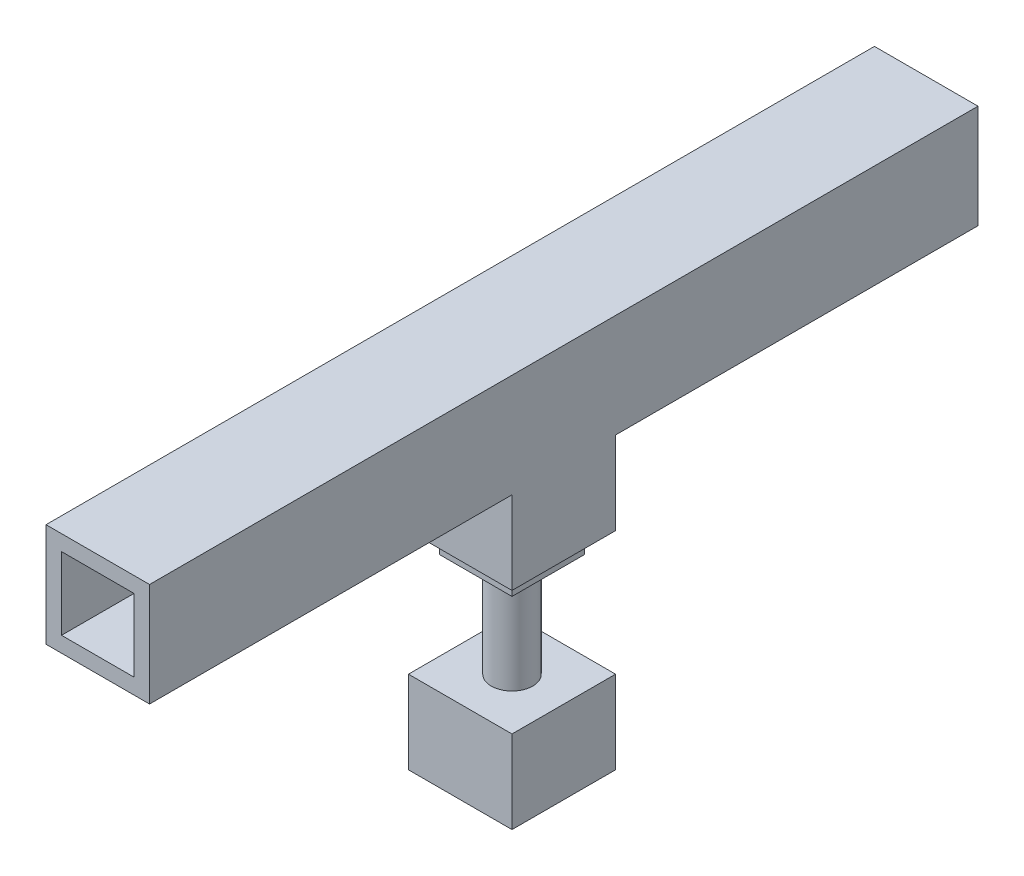
ISO-10303-21;
HEADER;
FILE_DESCRIPTION(('STEP AP214'),'2;1');
FILE_NAME('part.step','',(''),(''),'','','');
FILE_SCHEMA(('AUTOMOTIVE_DESIGN { 1 0 10303 214 1 1 1 1 }'));
ENDSEC;
DATA;
#1=APPLICATION_CONTEXT('core data for automotive mechanical design processes');
#2=APPLICATION_PROTOCOL_DEFINITION('international standard','automotive_design',2000,#1);
#3=PRODUCT_CONTEXT('',#1,'mechanical');
#4=PRODUCT('Part','Part','',(#3));
#5=PRODUCT_RELATED_PRODUCT_CATEGORY('part','',(#4));
#6=PRODUCT_DEFINITION_FORMATION('','',#4);
#7=PRODUCT_DEFINITION_CONTEXT('part definition',#1,'design');
#8=PRODUCT_DEFINITION('design','',#6,#7);
#9=PRODUCT_DEFINITION_SHAPE('','',#8);
#10=(LENGTH_UNIT() NAMED_UNIT(*) SI_UNIT(.MILLI.,.METRE.));
#11=(NAMED_UNIT(*) PLANE_ANGLE_UNIT() SI_UNIT($,.RADIAN.));
#12=(NAMED_UNIT(*) SI_UNIT($,.STERADIAN.) SOLID_ANGLE_UNIT());
#13=UNCERTAINTY_MEASURE_WITH_UNIT(LENGTH_MEASURE(1.E-05),#10,'distance_accuracy_value','');
#14=(GEOMETRIC_REPRESENTATION_CONTEXT(3) GLOBAL_UNCERTAINTY_ASSIGNED_CONTEXT((#13)) GLOBAL_UNIT_ASSIGNED_CONTEXT((#10,
#11,#12)) REPRESENTATION_CONTEXT('',''));
#15=CARTESIAN_POINT('',(0.,0.,0.));
#16=DIRECTION('',(0.,0.,1.));
#17=DIRECTION('',(1.,0.,0.));
#18=AXIS2_PLACEMENT_3D('',#15,#16,#17);
#19=CARTESIAN_POINT('',(0.,-75.,0.));
#20=DIRECTION('',(0.,-1.,0.));
#21=DIRECTION('',(0.,0.,-1.));
#22=AXIS2_PLACEMENT_3D('',#19,#20,#21);
#23=PLANE('',#22);
#24=CARTESIAN_POINT('',(0.,-75.,0.));
#25=DIRECTION('',(0.,-1.,0.));
#26=DIRECTION('',(0.,0.,-1.));
#27=AXIS2_PLACEMENT_3D('',#24,#25,#26);
#28=CIRCLE('',#27,10.);
#29=CARTESIAN_POINT('',(0.,-75.,-10.));
#30=VERTEX_POINT('',#29);
#31=EDGE_CURVE('E54',#30,#30,#28,.T.);
#32=ORIENTED_EDGE('',*,*,#31,.F.);
#33=EDGE_LOOP('',(#32));
#34=FACE_BOUND('',#33,.T.);
#35=CARTESIAN_POINT('',(0.,-75.,0.));
#36=DIRECTION('',(0.,-1.,0.));
#37=DIRECTION('',(0.,0.,-1.));
#38=AXIS2_PLACEMENT_3D('',#35,#36,#37);
#39=CIRCLE('',#38,5.);
#40=CARTESIAN_POINT('',(0.,-75.,-5.));
#41=VERTEX_POINT('',#40);
#42=EDGE_CURVE('E129',#41,#41,#39,.T.);
#43=ORIENTED_EDGE('',*,*,#42,.T.);
#44=EDGE_LOOP('',(#43));
#45=FACE_BOUND('',#44,.T.);
#46=ADVANCED_FACE('F50',(#34,#45),#23,.F.);
#47=CARTESIAN_POINT('',(0.,-125.,0.));
#48=DIRECTION('',(0.,1.,0.));
#49=DIRECTION('',(0.,0.,1.));
#50=AXIS2_PLACEMENT_3D('',#47,#48,#49);
#51=CYLINDRICAL_SURFACE('',#50,10.);
#52=CARTESIAN_POINT('',(0.,-125.,0.));
#53=DIRECTION('',(0.,-1.,0.));
#54=DIRECTION('',(0.,0.,-1.));
#55=AXIS2_PLACEMENT_3D('',#52,#53,#54);
#56=CIRCLE('',#55,10.);
#57=CARTESIAN_POINT('',(0.,-125.,-10.));
#58=VERTEX_POINT('',#57);
#59=EDGE_CURVE('E12',#58,#58,#56,.T.);
#60=ORIENTED_EDGE('',*,*,#59,.F.);
#61=EDGE_LOOP('',(#60));
#62=FACE_BOUND('',#61,.T.);
#63=ORIENTED_EDGE('',*,*,#31,.T.);
#64=EDGE_LOOP('',(#63));
#65=FACE_BOUND('',#64,.T.);
#66=ADVANCED_FACE('F52',(#62,#65),#51,.T.);
#67=CARTESIAN_POINT('',(0.,-125.,0.));
#68=DIRECTION('',(0.,1.,0.));
#69=DIRECTION('',(0.,0.,1.));
#70=AXIS2_PLACEMENT_3D('',#67,#68,#69);
#71=CYLINDRICAL_SURFACE('',#70,5.);
#72=ORIENTED_EDGE('',*,*,#42,.F.);
#73=EDGE_LOOP('',(#72));
#74=FACE_BOUND('',#73,.T.);
#75=CARTESIAN_POINT('',(0.,-165.,0.));
#76=DIRECTION('',(0.,-1.,0.));
#77=DIRECTION('',(0.,0.,-1.));
#78=AXIS2_PLACEMENT_3D('',#75,#76,#77);
#79=CIRCLE('',#78,5.);
#80=CARTESIAN_POINT('',(0.,-165.,-4.99999999999999));
#81=VERTEX_POINT('',#80);
#82=EDGE_CURVE('E122',#81,#81,#79,.T.);
#83=ORIENTED_EDGE('',*,*,#82,.T.);
#84=EDGE_LOOP('',(#83));
#85=FACE_BOUND('',#84,.T.);
#86=ADVANCED_FACE('F141',(#74,#85),#71,.F.);
#87=CARTESIAN_POINT('',(0.,-165.,0.));
#88=DIRECTION('',(0.,1.,0.));
#89=DIRECTION('',(0.,0.,1.));
#90=AXIS2_PLACEMENT_3D('',#87,#88,#89);
#91=PLANE('',#90);
#92=DIRECTION('',(0.,0.,1.));
#93=VECTOR('',#92,1.);
#94=CARTESIAN_POINT('',(25.,-165.,-25.));
#95=LINE('',#94,#93);
#96=CARTESIAN_POINT('',(25.,-165.,-25.));
#97=VERTEX_POINT('',#96);
#98=CARTESIAN_POINT('',(25.,-165.,25.));
#99=VERTEX_POINT('',#98);
#100=EDGE_CURVE('E104',#97,#99,#95,.T.);
#101=ORIENTED_EDGE('',*,*,#100,.T.);
#102=DIRECTION('',(-1.,0.,0.));
#103=VECTOR('',#102,1.);
#104=CARTESIAN_POINT('',(-25.,-165.,25.));
#105=LINE('',#104,#103);
#106=CARTESIAN_POINT('',(-25.,-165.,25.));
#107=VERTEX_POINT('',#106);
#108=EDGE_CURVE('E98',#99,#107,#105,.T.);
#109=ORIENTED_EDGE('',*,*,#108,.T.);
#110=DIRECTION('',(0.,0.,-1.));
#111=VECTOR('',#110,1.);
#112=CARTESIAN_POINT('',(-25.,-165.,-25.));
#113=LINE('',#112,#111);
#114=CARTESIAN_POINT('',(-25.,-165.,-25.));
#115=VERTEX_POINT('',#114);
#116=EDGE_CURVE('E102',#107,#115,#113,.T.);
#117=ORIENTED_EDGE('',*,*,#116,.T.);
#118=DIRECTION('',(1.,0.,0.));
#119=VECTOR('',#118,1.);
#120=CARTESIAN_POINT('',(-25.,-165.,-25.));
#121=LINE('',#120,#119);
#122=EDGE_CURVE('E67',#115,#97,#121,.T.);
#123=ORIENTED_EDGE('',*,*,#122,.T.);
#124=EDGE_LOOP('',(#101,#109,#117,#123));
#125=FACE_BOUND('',#124,.T.);
#126=ORIENTED_EDGE('',*,*,#82,.F.);
#127=EDGE_LOOP('',(#126));
#128=FACE_BOUND('',#127,.T.);
#129=ADVANCED_FACE('F99',(#125,#128),#91,.F.);
#130=CARTESIAN_POINT('',(0.,-125.,0.));
#131=DIRECTION('',(0.,1.,0.));
#132=DIRECTION('',(0.,0.,1.));
#133=AXIS2_PLACEMENT_3D('',#130,#131,#132);
#134=PLANE('',#133);
#135=ORIENTED_EDGE('',*,*,#59,.T.);
#136=EDGE_LOOP('',(#135));
#137=FACE_BOUND('',#136,.T.);
#138=DIRECTION('',(0.,0.,1.));
#139=VECTOR('',#138,1.);
#140=CARTESIAN_POINT('',(25.,-125.,-25.));
#141=LINE('',#140,#139);
#142=CARTESIAN_POINT('',(25.,-125.,-25.));
#143=VERTEX_POINT('',#142);
#144=CARTESIAN_POINT('',(25.,-125.,25.));
#145=VERTEX_POINT('',#144);
#146=EDGE_CURVE('E119',#143,#145,#141,.T.);
#147=ORIENTED_EDGE('',*,*,#146,.F.);
#148=DIRECTION('',(1.,0.,0.));
#149=VECTOR('',#148,1.);
#150=CARTESIAN_POINT('',(-25.,-125.,-25.));
#151=LINE('',#150,#149);
#152=CARTESIAN_POINT('',(-25.,-125.,-25.));
#153=VERTEX_POINT('',#152);
#154=EDGE_CURVE('E90',#153,#143,#151,.T.);
#155=ORIENTED_EDGE('',*,*,#154,.F.);
#156=DIRECTION('',(0.,0.,-1.));
#157=VECTOR('',#156,1.);
#158=CARTESIAN_POINT('',(-25.,-125.,-25.));
#159=LINE('',#158,#157);
#160=CARTESIAN_POINT('',(-25.,-125.,25.));
#161=VERTEX_POINT('',#160);
#162=EDGE_CURVE('E84',#161,#153,#159,.T.);
#163=ORIENTED_EDGE('',*,*,#162,.F.);
#164=DIRECTION('',(-1.,0.,0.));
#165=VECTOR('',#164,1.);
#166=CARTESIAN_POINT('',(-25.,-125.,25.));
#167=LINE('',#166,#165);
#168=EDGE_CURVE('E109',#145,#161,#167,.T.);
#169=ORIENTED_EDGE('',*,*,#168,.F.);
#170=EDGE_LOOP('',(#147,#155,#163,#169));
#171=FACE_BOUND('',#170,.T.);
#172=ADVANCED_FACE('F150',(#137,#171),#134,.T.);
#173=CARTESIAN_POINT('',(25.,-165.,-25.));
#174=DIRECTION('',(-1.,0.,0.));
#175=DIRECTION('',(0.,0.,1.));
#176=AXIS2_PLACEMENT_3D('',#173,#174,#175);
#177=PLANE('',#176);
#178=ORIENTED_EDGE('',*,*,#146,.T.);
#179=DIRECTION('',(0.,1.,0.));
#180=VECTOR('',#179,1.);
#181=CARTESIAN_POINT('',(25.,-165.,25.));
#182=LINE('',#181,#180);
#183=EDGE_CURVE('E110',#99,#145,#182,.T.);
#184=ORIENTED_EDGE('',*,*,#183,.F.);
#185=ORIENTED_EDGE('',*,*,#100,.F.);
#186=DIRECTION('',(0.,1.,0.));
#187=VECTOR('',#186,1.);
#188=CARTESIAN_POINT('',(25.,-165.,-25.));
#189=LINE('',#188,#187);
#190=EDGE_CURVE('E115',#97,#143,#189,.T.);
#191=ORIENTED_EDGE('',*,*,#190,.T.);
#192=EDGE_LOOP('',(#178,#184,#185,#191));
#193=FACE_BOUND('',#192,.T.);
#194=ADVANCED_FACE('F147',(#193),#177,.F.);
#195=CARTESIAN_POINT('',(-25.,-165.,25.));
#196=DIRECTION('',(0.,0.,-1.));
#197=DIRECTION('',(-1.,0.,0.));
#198=AXIS2_PLACEMENT_3D('',#195,#196,#197);
#199=PLANE('',#198);
#200=ORIENTED_EDGE('',*,*,#168,.T.);
#201=DIRECTION('',(0.,1.,0.));
#202=VECTOR('',#201,1.);
#203=CARTESIAN_POINT('',(-25.,-165.,25.));
#204=LINE('',#203,#202);
#205=EDGE_CURVE('E107',#107,#161,#204,.T.);
#206=ORIENTED_EDGE('',*,*,#205,.F.);
#207=ORIENTED_EDGE('',*,*,#108,.F.);
#208=ORIENTED_EDGE('',*,*,#183,.T.);
#209=EDGE_LOOP('',(#200,#206,#207,#208));
#210=FACE_BOUND('',#209,.T.);
#211=ADVANCED_FACE('F108',(#210),#199,.F.);
#212=CARTESIAN_POINT('',(-25.,-165.,-25.));
#213=DIRECTION('',(1.,0.,0.));
#214=DIRECTION('',(0.,0.,-1.));
#215=AXIS2_PLACEMENT_3D('',#212,#213,#214);
#216=PLANE('',#215);
#217=ORIENTED_EDGE('',*,*,#162,.T.);
#218=DIRECTION('',(0.,1.,0.));
#219=VECTOR('',#218,1.);
#220=CARTESIAN_POINT('',(-25.,-165.,-25.));
#221=LINE('',#220,#219);
#222=EDGE_CURVE('E111',#115,#153,#221,.T.);
#223=ORIENTED_EDGE('',*,*,#222,.F.);
#224=ORIENTED_EDGE('',*,*,#116,.F.);
#225=ORIENTED_EDGE('',*,*,#205,.T.);
#226=EDGE_LOOP('',(#217,#223,#224,#225));
#227=FACE_BOUND('',#226,.T.);
#228=ADVANCED_FACE('F113',(#227),#216,.F.);
#229=CARTESIAN_POINT('',(-25.,-165.,-25.));
#230=DIRECTION('',(0.,0.,1.));
#231=DIRECTION('',(1.,0.,0.));
#232=AXIS2_PLACEMENT_3D('',#229,#230,#231);
#233=PLANE('',#232);
#234=ORIENTED_EDGE('',*,*,#154,.T.);
#235=ORIENTED_EDGE('',*,*,#190,.F.);
#236=ORIENTED_EDGE('',*,*,#122,.F.);
#237=ORIENTED_EDGE('',*,*,#222,.T.);
#238=EDGE_LOOP('',(#234,#235,#236,#237));
#239=FACE_BOUND('',#238,.T.);
#240=ADVANCED_FACE('F156',(#239),#233,.F.);
#241=CLOSED_SHELL('',(#46,#66,#86,#129,#172,#194,#211,#228,#240));
#242=MANIFOLD_SOLID_BREP('B2',#241);
#243=CARTESIAN_POINT('',(0.,-75.,0.));
#244=DIRECTION('',(0.,-1.,0.));
#245=DIRECTION('',(0.,0.,-1.));
#246=AXIS2_PLACEMENT_3D('',#243,#244,#245);
#247=PLANE('',#246);
#248=DIRECTION('',(1.,0.,0.));
#249=VECTOR('',#248,1.);
#250=CARTESIAN_POINT('',(-17.5,-75.,-17.5));
#251=LINE('',#250,#249);
#252=CARTESIAN_POINT('',(-17.5,-75.,-17.5));
#253=VERTEX_POINT('',#252);
#254=CARTESIAN_POINT('',(17.5,-75.,-17.5));
#255=VERTEX_POINT('',#254);
#256=EDGE_CURVE('E289',#253,#255,#251,.T.);
#257=ORIENTED_EDGE('',*,*,#256,.T.);
#258=DIRECTION('',(0.,0.,1.));
#259=VECTOR('',#258,1.);
#260=CARTESIAN_POINT('',(17.5,-75.,-17.5));
#261=LINE('',#260,#259);
#262=CARTESIAN_POINT('',(17.5,-75.,17.5));
#263=VERTEX_POINT('',#262);
#264=EDGE_CURVE('E284',#255,#263,#261,.T.);
#265=ORIENTED_EDGE('',*,*,#264,.T.);
#266=DIRECTION('',(-1.,0.,0.));
#267=VECTOR('',#266,1.);
#268=CARTESIAN_POINT('',(17.5,-75.,17.5));
#269=LINE('',#268,#267);
#270=CARTESIAN_POINT('',(-17.5,-75.,17.5));
#271=VERTEX_POINT('',#270);
#272=EDGE_CURVE('E287',#263,#271,#269,.T.);
#273=ORIENTED_EDGE('',*,*,#272,.T.);
#274=DIRECTION('',(0.,0.,-1.));
#275=VECTOR('',#274,1.);
#276=CARTESIAN_POINT('',(-17.5,-75.,17.5));
#277=LINE('',#276,#275);
#278=EDGE_CURVE('E254',#271,#253,#277,.T.);
#279=ORIENTED_EDGE('',*,*,#278,.T.);
#280=EDGE_LOOP('',(#257,#265,#273,#279));
#281=FACE_BOUND('',#280,.T.);
#282=CARTESIAN_POINT('',(0.,-75.,0.));
#283=DIRECTION('',(0.,-1.,0.));
#284=DIRECTION('',(0.,0.,-1.));
#285=AXIS2_PLACEMENT_3D('',#282,#283,#284);
#286=CIRCLE('',#285,10.);
#287=CARTESIAN_POINT('',(0.,-75.,-10.));
#288=VERTEX_POINT('',#287);
#289=EDGE_CURVE('E304',#288,#288,#286,.T.);
#290=ORIENTED_EDGE('',*,*,#289,.F.);
#291=EDGE_LOOP('',(#290));
#292=FACE_BOUND('',#291,.T.);
#293=ADVANCED_FACE('F237',(#281,#292),#247,.T.);
#294=CARTESIAN_POINT('',(0.,-65.,0.));
#295=DIRECTION('',(0.,-1.,0.));
#296=DIRECTION('',(0.,0.,-1.));
#297=AXIS2_PLACEMENT_3D('',#294,#295,#296);
#298=PLANE('',#297);
#299=DIRECTION('',(1.,0.,0.));
#300=VECTOR('',#299,1.);
#301=CARTESIAN_POINT('',(-17.5,-65.,-17.5));
#302=LINE('',#301,#300);
#303=CARTESIAN_POINT('',(-17.5,-65.,-17.5));
#304=VERTEX_POINT('',#303);
#305=CARTESIAN_POINT('',(17.5,-65.,-17.5));
#306=VERTEX_POINT('',#305);
#307=EDGE_CURVE('E301',#304,#306,#302,.T.);
#308=ORIENTED_EDGE('',*,*,#307,.F.);
#309=DIRECTION('',(0.,0.,-1.));
#310=VECTOR('',#309,1.);
#311=CARTESIAN_POINT('',(-17.5,-65.,17.5));
#312=LINE('',#311,#310);
#313=CARTESIAN_POINT('',(-17.5,-65.,17.5));
#314=VERTEX_POINT('',#313);
#315=EDGE_CURVE('E277',#314,#304,#312,.T.);
#316=ORIENTED_EDGE('',*,*,#315,.F.);
#317=DIRECTION('',(-1.,0.,0.));
#318=VECTOR('',#317,1.);
#319=CARTESIAN_POINT('',(17.5,-65.,17.5));
#320=LINE('',#319,#318);
#321=CARTESIAN_POINT('',(17.5,-65.,17.5));
#322=VERTEX_POINT('',#321);
#323=EDGE_CURVE('E271',#322,#314,#320,.T.);
#324=ORIENTED_EDGE('',*,*,#323,.F.);
#325=DIRECTION('',(0.,0.,1.));
#326=VECTOR('',#325,1.);
#327=CARTESIAN_POINT('',(17.5,-65.,-17.5));
#328=LINE('',#327,#326);
#329=EDGE_CURVE('E293',#306,#322,#328,.T.);
#330=ORIENTED_EDGE('',*,*,#329,.F.);
#331=EDGE_LOOP('',(#308,#316,#324,#330));
#332=FACE_BOUND('',#331,.T.);
#333=CARTESIAN_POINT('',(0.,-65.,0.));
#334=DIRECTION('',(0.,-1.,0.));
#335=DIRECTION('',(0.,0.,-1.));
#336=AXIS2_PLACEMENT_3D('',#333,#334,#335);
#337=CIRCLE('',#336,10.);
#338=CARTESIAN_POINT('',(0.,-65.,-10.));
#339=VERTEX_POINT('',#338);
#340=EDGE_CURVE('E316',#339,#339,#337,.T.);
#341=ORIENTED_EDGE('',*,*,#340,.T.);
#342=EDGE_LOOP('',(#341));
#343=FACE_BOUND('',#342,.T.);
#344=ADVANCED_FACE('F312',(#332,#343),#298,.F.);
#345=CARTESIAN_POINT('',(-17.5,-75.,-17.5));
#346=DIRECTION('',(0.,0.,1.));
#347=DIRECTION('',(1.,0.,0.));
#348=AXIS2_PLACEMENT_3D('',#345,#346,#347);
#349=PLANE('',#348);
#350=ORIENTED_EDGE('',*,*,#307,.T.);
#351=DIRECTION('',(0.,1.,0.));
#352=VECTOR('',#351,1.);
#353=CARTESIAN_POINT('',(17.5,-75.,-17.5));
#354=LINE('',#353,#352);
#355=EDGE_CURVE('E48',#255,#306,#354,.T.);
#356=ORIENTED_EDGE('',*,*,#355,.F.);
#357=ORIENTED_EDGE('',*,*,#256,.F.);
#358=DIRECTION('',(0.,1.,0.));
#359=VECTOR('',#358,1.);
#360=CARTESIAN_POINT('',(-17.5,-75.,-17.5));
#361=LINE('',#360,#359);
#362=EDGE_CURVE('E297',#253,#304,#361,.T.);
#363=ORIENTED_EDGE('',*,*,#362,.T.);
#364=EDGE_LOOP('',(#350,#356,#357,#363));
#365=FACE_BOUND('',#364,.T.);
#366=ADVANCED_FACE('F239',(#365),#349,.F.);
#367=CARTESIAN_POINT('',(17.5,-75.,-17.5));
#368=DIRECTION('',(-1.,0.,0.));
#369=DIRECTION('',(0.,0.,1.));
#370=AXIS2_PLACEMENT_3D('',#367,#368,#369);
#371=PLANE('',#370);
#372=ORIENTED_EDGE('',*,*,#329,.T.);
#373=DIRECTION('',(0.,1.,0.));
#374=VECTOR('',#373,1.);
#375=CARTESIAN_POINT('',(17.5,-75.,17.5));
#376=LINE('',#375,#374);
#377=EDGE_CURVE('E246',#263,#322,#376,.T.);
#378=ORIENTED_EDGE('',*,*,#377,.F.);
#379=ORIENTED_EDGE('',*,*,#264,.F.);
#380=ORIENTED_EDGE('',*,*,#355,.T.);
#381=EDGE_LOOP('',(#372,#378,#379,#380));
#382=FACE_BOUND('',#381,.T.);
#383=ADVANCED_FACE('F292',(#382),#371,.F.);
#384=CARTESIAN_POINT('',(17.5,-75.,17.5));
#385=DIRECTION('',(0.,0.,-1.));
#386=DIRECTION('',(-1.,0.,0.));
#387=AXIS2_PLACEMENT_3D('',#384,#385,#386);
#388=PLANE('',#387);
#389=ORIENTED_EDGE('',*,*,#323,.T.);
#390=DIRECTION('',(0.,1.,0.));
#391=VECTOR('',#390,1.);
#392=CARTESIAN_POINT('',(-17.5,-75.,17.5));
#393=LINE('',#392,#391);
#394=EDGE_CURVE('E294',#271,#314,#393,.T.);
#395=ORIENTED_EDGE('',*,*,#394,.F.);
#396=ORIENTED_EDGE('',*,*,#272,.F.);
#397=ORIENTED_EDGE('',*,*,#377,.T.);
#398=EDGE_LOOP('',(#389,#395,#396,#397));
#399=FACE_BOUND('',#398,.T.);
#400=ADVANCED_FACE('F295',(#399),#388,.F.);
#401=CARTESIAN_POINT('',(-17.5,-75.,17.5));
#402=DIRECTION('',(1.,0.,0.));
#403=DIRECTION('',(0.,0.,-1.));
#404=AXIS2_PLACEMENT_3D('',#401,#402,#403);
#405=PLANE('',#404);
#406=ORIENTED_EDGE('',*,*,#315,.T.);
#407=ORIENTED_EDGE('',*,*,#362,.F.);
#408=ORIENTED_EDGE('',*,*,#278,.F.);
#409=ORIENTED_EDGE('',*,*,#394,.T.);
#410=EDGE_LOOP('',(#406,#407,#408,#409));
#411=FACE_BOUND('',#410,.T.);
#412=ADVANCED_FACE('F309',(#411),#405,.F.);
#413=CARTESIAN_POINT('',(0.,-75.,0.));
#414=DIRECTION('',(0.,1.,0.));
#415=DIRECTION('',(0.,0.,1.));
#416=AXIS2_PLACEMENT_3D('',#413,#414,#415);
#417=CYLINDRICAL_SURFACE('',#416,10.);
#418=ORIENTED_EDGE('',*,*,#289,.T.);
#419=EDGE_LOOP('',(#418));
#420=FACE_BOUND('',#419,.T.);
#421=ORIENTED_EDGE('',*,*,#340,.F.);
#422=EDGE_LOOP('',(#421));
#423=FACE_BOUND('',#422,.T.);
#424=ADVANCED_FACE('F322',(#420,#423),#417,.F.);
#425=CLOSED_SHELL('',(#293,#344,#366,#383,#400,#412,#424));
#426=MANIFOLD_SOLID_BREP('B6',#425);
#427=CARTESIAN_POINT('',(-17.5,-17.5,200.));
#428=DIRECTION('',(0.,1.,0.));
#429=DIRECTION('',(0.,0.,1.));
#430=AXIS2_PLACEMENT_3D('',#427,#428,#429);
#431=PLANE('',#430);
#432=DIRECTION('',(-1.,0.,0.));
#433=VECTOR('',#432,1.);
#434=CARTESIAN_POINT('',(-17.5,-17.5,-17.5));
#435=LINE('',#434,#433);
#436=CARTESIAN_POINT('',(17.5,-17.5,-17.5));
#437=VERTEX_POINT('',#436);
#438=CARTESIAN_POINT('',(-17.5,-17.5,-17.5));
#439=VERTEX_POINT('',#438);
#440=EDGE_CURVE('E500',#437,#439,#435,.T.);
#441=ORIENTED_EDGE('',*,*,#440,.F.);
#442=DIRECTION('',(0.,0.,-1.));
#443=VECTOR('',#442,1.);
#444=CARTESIAN_POINT('',(17.5,-17.5,200.));
#445=LINE('',#444,#443);
#446=CARTESIAN_POINT('',(17.5,-17.5,-200.));
#447=VERTEX_POINT('',#446);
#448=EDGE_CURVE('E511',#437,#447,#445,.T.);
#449=ORIENTED_EDGE('',*,*,#448,.T.);
#450=DIRECTION('',(1.,0.,0.));
#451=VECTOR('',#450,1.);
#452=CARTESIAN_POINT('',(-17.5,-17.5,-200.));
#453=LINE('',#452,#451);
#454=CARTESIAN_POINT('',(-17.5,-17.5,-200.));
#455=VERTEX_POINT('',#454);
#456=EDGE_CURVE('E534',#455,#447,#453,.T.);
#457=ORIENTED_EDGE('',*,*,#456,.F.);
#458=DIRECTION('',(0.,0.,-1.));
#459=VECTOR('',#458,1.);
#460=CARTESIAN_POINT('',(-17.5,-17.5,200.));
#461=LINE('',#460,#459);
#462=EDGE_CURVE('E513',#439,#455,#461,.T.);
#463=ORIENTED_EDGE('',*,*,#462,.F.);
#464=EDGE_LOOP('',(#441,#449,#457,#463));
#465=FACE_BOUND('',#464,.T.);
#466=ADVANCED_FACE('F382',(#465),#431,.T.);
#467=CARTESIAN_POINT('',(-25.,-25.,200.));
#468=DIRECTION('',(0.,1.,0.));
#469=DIRECTION('',(0.,0.,1.));
#470=AXIS2_PLACEMENT_3D('',#467,#468,#469);
#471=PLANE('',#470);
#472=DIRECTION('',(1.,0.,0.));
#473=VECTOR('',#472,1.);
#474=CARTESIAN_POINT('',(-25.,-25.,-25.));
#475=LINE('',#474,#473);
#476=CARTESIAN_POINT('',(-25.,-25.,-25.));
#477=VERTEX_POINT('',#476);
#478=CARTESIAN_POINT('',(25.,-25.,-25.));
#479=VERTEX_POINT('',#478);
#480=EDGE_CURVE('E406',#477,#479,#475,.T.);
#481=ORIENTED_EDGE('',*,*,#480,.F.);
#482=DIRECTION('',(0.,0.,-1.));
#483=VECTOR('',#482,1.);
#484=CARTESIAN_POINT('',(-25.,-25.,200.));
#485=LINE('',#484,#483);
#486=CARTESIAN_POINT('',(-25.,-25.,-200.));
#487=VERTEX_POINT('',#486);
#488=EDGE_CURVE('E579',#477,#487,#485,.T.);
#489=ORIENTED_EDGE('',*,*,#488,.T.);
#490=DIRECTION('',(1.,0.,0.));
#491=VECTOR('',#490,1.);
#492=CARTESIAN_POINT('',(-25.,-25.,-200.));
#493=LINE('',#492,#491);
#494=CARTESIAN_POINT('',(25.,-25.,-200.));
#495=VERTEX_POINT('',#494);
#496=EDGE_CURVE('E552',#487,#495,#493,.T.);
#497=ORIENTED_EDGE('',*,*,#496,.T.);
#498=DIRECTION('',(0.,0.,-1.));
#499=VECTOR('',#498,1.);
#500=CARTESIAN_POINT('',(25.,-25.,200.));
#501=LINE('',#500,#499);
#502=EDGE_CURVE('E561',#479,#495,#501,.T.);
#503=ORIENTED_EDGE('',*,*,#502,.F.);
#504=EDGE_LOOP('',(#481,#489,#497,#503));
#505=FACE_BOUND('',#504,.T.);
#506=ADVANCED_FACE('F596',(#505),#471,.F.);
#507=DIRECTION('',(-1.,0.,0.));
#508=VECTOR('',#507,1.);
#509=CARTESIAN_POINT('',(-25.,-25.,25.));
#510=LINE('',#509,#508);
#511=CARTESIAN_POINT('',(25.,-25.,25.));
#512=VERTEX_POINT('',#511);
#513=CARTESIAN_POINT('',(-25.,-25.,25.));
#514=VERTEX_POINT('',#513);
#515=EDGE_CURVE('E646',#512,#514,#510,.T.);
#516=ORIENTED_EDGE('',*,*,#515,.F.);
#517=CARTESIAN_POINT('',(25.,-25.,200.));
#518=VERTEX_POINT('',#517);
#519=EDGE_CURVE('E575',#518,#512,#501,.T.);
#520=ORIENTED_EDGE('',*,*,#519,.F.);
#521=DIRECTION('',(1.,0.,0.));
#522=VECTOR('',#521,1.);
#523=CARTESIAN_POINT('',(-25.,-25.,200.));
#524=LINE('',#523,#522);
#525=CARTESIAN_POINT('',(-25.,-25.,200.));
#526=VERTEX_POINT('',#525);
#527=EDGE_CURVE('E558',#526,#518,#524,.T.);
#528=ORIENTED_EDGE('',*,*,#527,.F.);
#529=EDGE_CURVE('E580',#526,#514,#485,.T.);
#530=ORIENTED_EDGE('',*,*,#529,.T.);
#531=EDGE_LOOP('',(#516,#520,#528,#530));
#532=FACE_BOUND('',#531,.T.);
#533=ADVANCED_FACE('F716',(#532),#471,.F.);
#534=CARTESIAN_POINT('',(0.,0.,200.));
#535=DIRECTION('',(0.,0.,-1.));
#536=DIRECTION('',(-1.,0.,0.));
#537=AXIS2_PLACEMENT_3D('',#534,#535,#536);
#538=PLANE('',#537);
#539=DIRECTION('',(0.,1.,0.));
#540=VECTOR('',#539,1.);
#541=CARTESIAN_POINT('',(25.,-25.,200.));
#542=LINE('',#541,#540);
#543=CARTESIAN_POINT('',(25.,25.,200.));
#544=VERTEX_POINT('',#543);
#545=EDGE_CURVE('E547',#518,#544,#542,.T.);
#546=ORIENTED_EDGE('',*,*,#545,.T.);
#547=DIRECTION('',(-1.,0.,0.));
#548=VECTOR('',#547,1.);
#549=CARTESIAN_POINT('',(-25.,25.,200.));
#550=LINE('',#549,#548);
#551=CARTESIAN_POINT('',(-25.,25.,200.));
#552=VERTEX_POINT('',#551);
#553=EDGE_CURVE('E551',#544,#552,#550,.T.);
#554=ORIENTED_EDGE('',*,*,#553,.T.);
#555=DIRECTION('',(0.,-1.,0.));
#556=VECTOR('',#555,1.);
#557=CARTESIAN_POINT('',(-25.,-25.,200.));
#558=LINE('',#557,#556);
#559=EDGE_CURVE('E555',#552,#526,#558,.T.);
#560=ORIENTED_EDGE('',*,*,#559,.T.);
#561=ORIENTED_EDGE('',*,*,#527,.T.);
#562=EDGE_LOOP('',(#546,#554,#560,#561));
#563=FACE_BOUND('',#562,.T.);
#564=DIRECTION('',(0.,1.,0.));
#565=VECTOR('',#564,1.);
#566=CARTESIAN_POINT('',(17.5,-17.5,200.));
#567=LINE('',#566,#565);
#568=CARTESIAN_POINT('',(17.5,-17.5,200.));
#569=VERTEX_POINT('',#568);
#570=CARTESIAN_POINT('',(17.5,17.5,200.));
#571=VERTEX_POINT('',#570);
#572=EDGE_CURVE('E611',#569,#571,#567,.T.);
#573=ORIENTED_EDGE('',*,*,#572,.F.);
#574=DIRECTION('',(1.,0.,0.));
#575=VECTOR('',#574,1.);
#576=CARTESIAN_POINT('',(-17.5,-17.5,200.));
#577=LINE('',#576,#575);
#578=CARTESIAN_POINT('',(-17.5,-17.5,200.));
#579=VERTEX_POINT('',#578);
#580=EDGE_CURVE('E525',#579,#569,#577,.T.);
#581=ORIENTED_EDGE('',*,*,#580,.F.);
#582=DIRECTION('',(0.,-1.,0.));
#583=VECTOR('',#582,1.);
#584=CARTESIAN_POINT('',(-17.5,-17.5,200.));
#585=LINE('',#584,#583);
#586=CARTESIAN_POINT('',(-17.5,17.5,200.));
#587=VERTEX_POINT('',#586);
#588=EDGE_CURVE('E530',#587,#579,#585,.T.);
#589=ORIENTED_EDGE('',*,*,#588,.F.);
#590=DIRECTION('',(-1.,0.,0.));
#591=VECTOR('',#590,1.);
#592=CARTESIAN_POINT('',(-17.5,17.5,200.));
#593=LINE('',#592,#591);
#594=EDGE_CURVE('E623',#571,#587,#593,.T.);
#595=ORIENTED_EDGE('',*,*,#594,.F.);
#596=EDGE_LOOP('',(#573,#581,#589,#595));
#597=FACE_BOUND('',#596,.T.);
#598=ADVANCED_FACE('F691',(#563,#597),#538,.F.);
#599=CARTESIAN_POINT('',(0.,0.,-200.));
#600=DIRECTION('',(0.,0.,-1.));
#601=DIRECTION('',(-1.,0.,0.));
#602=AXIS2_PLACEMENT_3D('',#599,#600,#601);
#603=PLANE('',#602);
#604=DIRECTION('',(0.,1.,0.));
#605=VECTOR('',#604,1.);
#606=CARTESIAN_POINT('',(25.,-25.,-200.));
#607=LINE('',#606,#605);
#608=CARTESIAN_POINT('',(25.,25.,-200.));
#609=VERTEX_POINT('',#608);
#610=EDGE_CURVE('E546',#495,#609,#607,.T.);
#611=ORIENTED_EDGE('',*,*,#610,.F.);
#612=ORIENTED_EDGE('',*,*,#496,.F.);
#613=DIRECTION('',(0.,-1.,0.));
#614=VECTOR('',#613,1.);
#615=CARTESIAN_POINT('',(-25.,-25.,-200.));
#616=LINE('',#615,#614);
#617=CARTESIAN_POINT('',(-25.,25.,-200.));
#618=VERTEX_POINT('',#617);
#619=EDGE_CURVE('E568',#618,#487,#616,.T.);
#620=ORIENTED_EDGE('',*,*,#619,.F.);
#621=DIRECTION('',(-1.,0.,0.));
#622=VECTOR('',#621,1.);
#623=CARTESIAN_POINT('',(-25.,25.,-200.));
#624=LINE('',#623,#622);
#625=EDGE_CURVE('E565',#609,#618,#624,.T.);
#626=ORIENTED_EDGE('',*,*,#625,.F.);
#627=EDGE_LOOP('',(#611,#612,#620,#626));
#628=FACE_BOUND('',#627,.T.);
#629=ORIENTED_EDGE('',*,*,#456,.T.);
#630=DIRECTION('',(0.,1.,0.));
#631=VECTOR('',#630,1.);
#632=CARTESIAN_POINT('',(17.5,-17.5,-200.));
#633=LINE('',#632,#631);
#634=CARTESIAN_POINT('',(17.5,17.5,-200.));
#635=VERTEX_POINT('',#634);
#636=EDGE_CURVE('E521',#447,#635,#633,.T.);
#637=ORIENTED_EDGE('',*,*,#636,.T.);
#638=DIRECTION('',(-1.,0.,0.));
#639=VECTOR('',#638,1.);
#640=CARTESIAN_POINT('',(-17.5,17.5,-200.));
#641=LINE('',#640,#639);
#642=CARTESIAN_POINT('',(-17.5,17.5,-200.));
#643=VERTEX_POINT('',#642);
#644=EDGE_CURVE('E612',#635,#643,#641,.T.);
#645=ORIENTED_EDGE('',*,*,#644,.T.);
#646=DIRECTION('',(0.,-1.,0.));
#647=VECTOR('',#646,1.);
#648=CARTESIAN_POINT('',(-17.5,-17.5,-200.));
#649=LINE('',#648,#647);
#650=EDGE_CURVE('E607',#643,#455,#649,.T.);
#651=ORIENTED_EDGE('',*,*,#650,.T.);
#652=EDGE_LOOP('',(#629,#637,#645,#651));
#653=FACE_BOUND('',#652,.T.);
#654=ADVANCED_FACE('F594',(#628,#653),#603,.T.);
#655=CARTESIAN_POINT('',(25.,-25.,200.));
#656=DIRECTION('',(-1.,0.,0.));
#657=DIRECTION('',(0.,0.,1.));
#658=AXIS2_PLACEMENT_3D('',#655,#656,#657);
#659=PLANE('',#658);
#660=ORIENTED_EDGE('',*,*,#610,.T.);
#661=DIRECTION('',(0.,0.,-1.));
#662=VECTOR('',#661,1.);
#663=CARTESIAN_POINT('',(25.,25.,200.));
#664=LINE('',#663,#662);
#665=EDGE_CURVE('E235',#544,#609,#664,.T.);
#666=ORIENTED_EDGE('',*,*,#665,.F.);
#667=ORIENTED_EDGE('',*,*,#545,.F.);
#668=ORIENTED_EDGE('',*,*,#519,.T.);
#669=DIRECTION('',(0.,1.,0.));
#670=VECTOR('',#669,1.);
#671=CARTESIAN_POINT('',(25.,-65.,25.));
#672=LINE('',#671,#670);
#673=CARTESIAN_POINT('',(25.,-65.,25.));
#674=VERTEX_POINT('',#673);
#675=EDGE_CURVE('E618',#674,#512,#672,.T.);
#676=ORIENTED_EDGE('',*,*,#675,.F.);
#677=DIRECTION('',(0.,0.,1.));
#678=VECTOR('',#677,1.);
#679=CARTESIAN_POINT('',(25.,-65.,-25.));
#680=LINE('',#679,#678);
#681=CARTESIAN_POINT('',(25.,-65.,-25.));
#682=VERTEX_POINT('',#681);
#683=EDGE_CURVE('E645',#682,#674,#680,.T.);
#684=ORIENTED_EDGE('',*,*,#683,.F.);
#685=DIRECTION('',(0.,1.,0.));
#686=VECTOR('',#685,1.);
#687=CARTESIAN_POINT('',(25.,-65.,-25.));
#688=LINE('',#687,#686);
#689=EDGE_CURVE('E638',#682,#479,#688,.T.);
#690=ORIENTED_EDGE('',*,*,#689,.T.);
#691=ORIENTED_EDGE('',*,*,#502,.T.);
#692=EDGE_LOOP('',(#660,#666,#667,#668,#676,#684,#690,#691));
#693=FACE_BOUND('',#692,.T.);
#694=ADVANCED_FACE('F384',(#693),#659,.F.);
#695=CARTESIAN_POINT('',(-25.,25.,200.));
#696=DIRECTION('',(0.,-1.,0.));
#697=DIRECTION('',(0.,0.,-1.));
#698=AXIS2_PLACEMENT_3D('',#695,#696,#697);
#699=PLANE('',#698);
#700=ORIENTED_EDGE('',*,*,#625,.T.);
#701=DIRECTION('',(0.,0.,-1.));
#702=VECTOR('',#701,1.);
#703=CARTESIAN_POINT('',(-25.,25.,200.));
#704=LINE('',#703,#702);
#705=EDGE_CURVE('E391',#552,#618,#704,.T.);
#706=ORIENTED_EDGE('',*,*,#705,.F.);
#707=ORIENTED_EDGE('',*,*,#553,.F.);
#708=ORIENTED_EDGE('',*,*,#665,.T.);
#709=EDGE_LOOP('',(#700,#706,#707,#708));
#710=FACE_BOUND('',#709,.T.);
#711=ADVANCED_FACE('F731',(#710),#699,.F.);
#712=CARTESIAN_POINT('',(-25.,-25.,200.));
#713=DIRECTION('',(1.,0.,0.));
#714=DIRECTION('',(0.,0.,-1.));
#715=AXIS2_PLACEMENT_3D('',#712,#713,#714);
#716=PLANE('',#715);
#717=ORIENTED_EDGE('',*,*,#619,.T.);
#718=ORIENTED_EDGE('',*,*,#488,.F.);
#719=DIRECTION('',(0.,1.,0.));
#720=VECTOR('',#719,1.);
#721=CARTESIAN_POINT('',(-25.,-65.,-25.));
#722=LINE('',#721,#720);
#723=CARTESIAN_POINT('',(-25.,-65.,-25.));
#724=VERTEX_POINT('',#723);
#725=EDGE_CURVE('E635',#724,#477,#722,.T.);
#726=ORIENTED_EDGE('',*,*,#725,.F.);
#727=DIRECTION('',(0.,0.,-1.));
#728=VECTOR('',#727,1.);
#729=CARTESIAN_POINT('',(-25.,-65.,-25.));
#730=LINE('',#729,#728);
#731=CARTESIAN_POINT('',(-25.,-65.,25.));
#732=VERTEX_POINT('',#731);
#733=EDGE_CURVE('E652',#732,#724,#730,.T.);
#734=ORIENTED_EDGE('',*,*,#733,.F.);
#735=DIRECTION('',(0.,1.,0.));
#736=VECTOR('',#735,1.);
#737=CARTESIAN_POINT('',(-25.,-65.,25.));
#738=LINE('',#737,#736);
#739=EDGE_CURVE('E631',#732,#514,#738,.T.);
#740=ORIENTED_EDGE('',*,*,#739,.T.);
#741=ORIENTED_EDGE('',*,*,#529,.F.);
#742=ORIENTED_EDGE('',*,*,#559,.F.);
#743=ORIENTED_EDGE('',*,*,#705,.T.);
#744=EDGE_LOOP('',(#717,#718,#726,#734,#740,#741,#742,#743));
#745=FACE_BOUND('',#744,.T.);
#746=ADVANCED_FACE('F588',(#745),#716,.F.);
#747=CARTESIAN_POINT('',(17.5,-17.5,200.));
#748=DIRECTION('',(-1.,0.,0.));
#749=DIRECTION('',(0.,0.,1.));
#750=AXIS2_PLACEMENT_3D('',#747,#748,#749);
#751=PLANE('',#750);
#752=ORIENTED_EDGE('',*,*,#448,.F.);
#753=DIRECTION('',(0.,1.,0.));
#754=VECTOR('',#753,1.);
#755=CARTESIAN_POINT('',(17.5,-65.,-17.5));
#756=LINE('',#755,#754);
#757=CARTESIAN_POINT('',(17.5,-65.,-17.5));
#758=VERTEX_POINT('',#757);
#759=EDGE_CURVE('E497',#758,#437,#756,.T.);
#760=ORIENTED_EDGE('',*,*,#759,.F.);
#761=DIRECTION('',(0.,0.,1.));
#762=VECTOR('',#761,1.);
#763=CARTESIAN_POINT('',(17.5,-65.,-17.5));
#764=LINE('',#763,#762);
#765=CARTESIAN_POINT('',(17.5,-65.,17.5));
#766=VERTEX_POINT('',#765);
#767=EDGE_CURVE('E515',#758,#766,#764,.T.);
#768=ORIENTED_EDGE('',*,*,#767,.T.);
#769=DIRECTION('',(0.,1.,0.));
#770=VECTOR('',#769,1.);
#771=CARTESIAN_POINT('',(17.5,-65.,17.5));
#772=LINE('',#771,#770);
#773=CARTESIAN_POINT('',(17.5,-17.5,17.5));
#774=VERTEX_POINT('',#773);
#775=EDGE_CURVE('E398',#766,#774,#772,.T.);
#776=ORIENTED_EDGE('',*,*,#775,.T.);
#777=EDGE_CURVE('E524',#569,#774,#445,.T.);
#778=ORIENTED_EDGE('',*,*,#777,.F.);
#779=ORIENTED_EDGE('',*,*,#572,.T.);
#780=DIRECTION('',(0.,0.,-1.));
#781=VECTOR('',#780,1.);
#782=CARTESIAN_POINT('',(17.5,17.5,200.));
#783=LINE('',#782,#781);
#784=EDGE_CURVE('E543',#571,#635,#783,.T.);
#785=ORIENTED_EDGE('',*,*,#784,.T.);
#786=ORIENTED_EDGE('',*,*,#636,.F.);
#787=EDGE_LOOP('',(#752,#760,#768,#776,#778,#779,#785,#786));
#788=FACE_BOUND('',#787,.T.);
#789=ADVANCED_FACE('F518',(#788),#751,.T.);
#790=CARTESIAN_POINT('',(-17.5,17.5,200.));
#791=DIRECTION('',(0.,-1.,0.));
#792=DIRECTION('',(0.,0.,-1.));
#793=AXIS2_PLACEMENT_3D('',#790,#791,#792);
#794=PLANE('',#793);
#795=ORIENTED_EDGE('',*,*,#644,.F.);
#796=ORIENTED_EDGE('',*,*,#784,.F.);
#797=ORIENTED_EDGE('',*,*,#594,.T.);
#798=DIRECTION('',(0.,0.,-1.));
#799=VECTOR('',#798,1.);
#800=CARTESIAN_POINT('',(-17.5,17.5,200.));
#801=LINE('',#800,#799);
#802=EDGE_CURVE('E540',#587,#643,#801,.T.);
#803=ORIENTED_EDGE('',*,*,#802,.T.);
#804=EDGE_LOOP('',(#795,#796,#797,#803));
#805=FACE_BOUND('',#804,.T.);
#806=ADVANCED_FACE('F694',(#805),#794,.T.);
#807=CARTESIAN_POINT('',(-17.5,-17.5,200.));
#808=DIRECTION('',(1.,0.,0.));
#809=DIRECTION('',(0.,0.,-1.));
#810=AXIS2_PLACEMENT_3D('',#807,#808,#809);
#811=PLANE('',#810);
#812=CARTESIAN_POINT('',(-17.5,-17.5,17.5));
#813=VERTEX_POINT('',#812);
#814=EDGE_CURVE('E536',#579,#813,#461,.T.);
#815=ORIENTED_EDGE('',*,*,#814,.T.);
#816=DIRECTION('',(0.,1.,0.));
#817=VECTOR('',#816,1.);
#818=CARTESIAN_POINT('',(-17.5,-65.,17.5));
#819=LINE('',#818,#817);
#820=CARTESIAN_POINT('',(-17.5,-65.,17.5));
#821=VERTEX_POINT('',#820);
#822=EDGE_CURVE('E663',#821,#813,#819,.T.);
#823=ORIENTED_EDGE('',*,*,#822,.F.);
#824=DIRECTION('',(0.,0.,-1.));
#825=VECTOR('',#824,1.);
#826=CARTESIAN_POINT('',(-17.5,-65.,-17.5));
#827=LINE('',#826,#825);
#828=CARTESIAN_POINT('',(-17.5,-65.,-17.5));
#829=VERTEX_POINT('',#828);
#830=EDGE_CURVE('E670',#821,#829,#827,.T.);
#831=ORIENTED_EDGE('',*,*,#830,.T.);
#832=DIRECTION('',(0.,1.,0.));
#833=VECTOR('',#832,1.);
#834=CARTESIAN_POINT('',(-17.5,-65.,-17.5));
#835=LINE('',#834,#833);
#836=EDGE_CURVE('E507',#829,#439,#835,.T.);
#837=ORIENTED_EDGE('',*,*,#836,.T.);
#838=ORIENTED_EDGE('',*,*,#462,.T.);
#839=ORIENTED_EDGE('',*,*,#650,.F.);
#840=ORIENTED_EDGE('',*,*,#802,.F.);
#841=ORIENTED_EDGE('',*,*,#588,.T.);
#842=EDGE_LOOP('',(#815,#823,#831,#837,#838,#839,#840,#841));
#843=FACE_BOUND('',#842,.T.);
#844=ADVANCED_FACE('F604',(#843),#811,.T.);
#845=DIRECTION('',(1.,0.,0.));
#846=VECTOR('',#845,1.);
#847=CARTESIAN_POINT('',(-17.5,-17.5,17.5));
#848=LINE('',#847,#846);
#849=EDGE_CURVE('E516',#813,#774,#848,.T.);
#850=ORIENTED_EDGE('',*,*,#849,.F.);
#851=ORIENTED_EDGE('',*,*,#814,.F.);
#852=ORIENTED_EDGE('',*,*,#580,.T.);
#853=ORIENTED_EDGE('',*,*,#777,.T.);
#854=EDGE_LOOP('',(#850,#851,#852,#853));
#855=FACE_BOUND('',#854,.T.);
#856=ADVANCED_FACE('F685',(#855),#431,.T.);
#857=CARTESIAN_POINT('',(0.,-65.,0.));
#858=DIRECTION('',(0.,1.,0.));
#859=DIRECTION('',(0.,0.,1.));
#860=AXIS2_PLACEMENT_3D('',#857,#858,#859);
#861=PLANE('',#860);
#862=ORIENTED_EDGE('',*,*,#683,.T.);
#863=DIRECTION('',(-1.,0.,0.));
#864=VECTOR('',#863,1.);
#865=CARTESIAN_POINT('',(-25.,-65.,25.));
#866=LINE('',#865,#864);
#867=EDGE_CURVE('E655',#674,#732,#866,.T.);
#868=ORIENTED_EDGE('',*,*,#867,.T.);
#869=ORIENTED_EDGE('',*,*,#733,.T.);
#870=DIRECTION('',(1.,0.,0.));
#871=VECTOR('',#870,1.);
#872=CARTESIAN_POINT('',(-25.,-65.,-25.));
#873=LINE('',#872,#871);
#874=EDGE_CURVE('E642',#724,#682,#873,.T.);
#875=ORIENTED_EDGE('',*,*,#874,.T.);
#876=EDGE_LOOP('',(#862,#868,#869,#875));
#877=FACE_BOUND('',#876,.T.);
#878=ORIENTED_EDGE('',*,*,#767,.F.);
#879=DIRECTION('',(1.,0.,0.));
#880=VECTOR('',#879,1.);
#881=CARTESIAN_POINT('',(-17.5,-65.,-17.5));
#882=LINE('',#881,#880);
#883=EDGE_CURVE('E503',#829,#758,#882,.T.);
#884=ORIENTED_EDGE('',*,*,#883,.F.);
#885=ORIENTED_EDGE('',*,*,#830,.F.);
#886=DIRECTION('',(-1.,0.,0.));
#887=VECTOR('',#886,1.);
#888=CARTESIAN_POINT('',(-17.5,-65.,17.5));
#889=LINE('',#888,#887);
#890=EDGE_CURVE('E673',#766,#821,#889,.T.);
#891=ORIENTED_EDGE('',*,*,#890,.F.);
#892=EDGE_LOOP('',(#878,#884,#885,#891));
#893=FACE_BOUND('',#892,.T.);
#894=ADVANCED_FACE('F697',(#877,#893),#861,.F.);
#895=CARTESIAN_POINT('',(-25.,-65.,25.));
#896=DIRECTION('',(0.,0.,-1.));
#897=DIRECTION('',(-1.,0.,0.));
#898=AXIS2_PLACEMENT_3D('',#895,#896,#897);
#899=PLANE('',#898);
#900=ORIENTED_EDGE('',*,*,#515,.T.);
#901=ORIENTED_EDGE('',*,*,#739,.F.);
#902=ORIENTED_EDGE('',*,*,#867,.F.);
#903=ORIENTED_EDGE('',*,*,#675,.T.);
#904=EDGE_LOOP('',(#900,#901,#902,#903));
#905=FACE_BOUND('',#904,.T.);
#906=ADVANCED_FACE('F699',(#905),#899,.F.);
#907=CARTESIAN_POINT('',(-25.,-65.,-25.));
#908=DIRECTION('',(0.,0.,1.));
#909=DIRECTION('',(1.,0.,0.));
#910=AXIS2_PLACEMENT_3D('',#907,#908,#909);
#911=PLANE('',#910);
#912=ORIENTED_EDGE('',*,*,#480,.T.);
#913=ORIENTED_EDGE('',*,*,#689,.F.);
#914=ORIENTED_EDGE('',*,*,#874,.F.);
#915=ORIENTED_EDGE('',*,*,#725,.T.);
#916=EDGE_LOOP('',(#912,#913,#914,#915));
#917=FACE_BOUND('',#916,.T.);
#918=ADVANCED_FACE('F706',(#917),#911,.F.);
#919=CARTESIAN_POINT('',(-17.5,-65.,17.5));
#920=DIRECTION('',(0.,0.,-1.));
#921=DIRECTION('',(-1.,0.,0.));
#922=AXIS2_PLACEMENT_3D('',#919,#920,#921);
#923=PLANE('',#922);
#924=ORIENTED_EDGE('',*,*,#822,.T.);
#925=ORIENTED_EDGE('',*,*,#849,.T.);
#926=ORIENTED_EDGE('',*,*,#775,.F.);
#927=ORIENTED_EDGE('',*,*,#890,.T.);
#928=EDGE_LOOP('',(#924,#925,#926,#927));
#929=FACE_BOUND('',#928,.T.);
#930=ADVANCED_FACE('F681',(#929),#923,.T.);
#931=CARTESIAN_POINT('',(-17.5,-65.,-17.5));
#932=DIRECTION('',(0.,0.,1.));
#933=DIRECTION('',(1.,0.,0.));
#934=AXIS2_PLACEMENT_3D('',#931,#932,#933);
#935=PLANE('',#934);
#936=ORIENTED_EDGE('',*,*,#759,.T.);
#937=ORIENTED_EDGE('',*,*,#440,.T.);
#938=ORIENTED_EDGE('',*,*,#836,.F.);
#939=ORIENTED_EDGE('',*,*,#883,.T.);
#940=EDGE_LOOP('',(#936,#937,#938,#939));
#941=FACE_BOUND('',#940,.T.);
#942=ADVANCED_FACE('F499',(#941),#935,.T.);
#943=CLOSED_SHELL('',(#466,#506,#533,#598,#654,#694,#711,#746,#789,#806,#844,#856,#894,#906,
#918,#930,#942));
#944=MANIFOLD_SOLID_BREP('B42',#943);
#945=ADVANCED_BREP_SHAPE_REPRESENTATION('',(#18,#242,#426,#944),#14);
#946=SHAPE_DEFINITION_REPRESENTATION(#9,#945);
ENDSEC;
END-ISO-10303-21;
